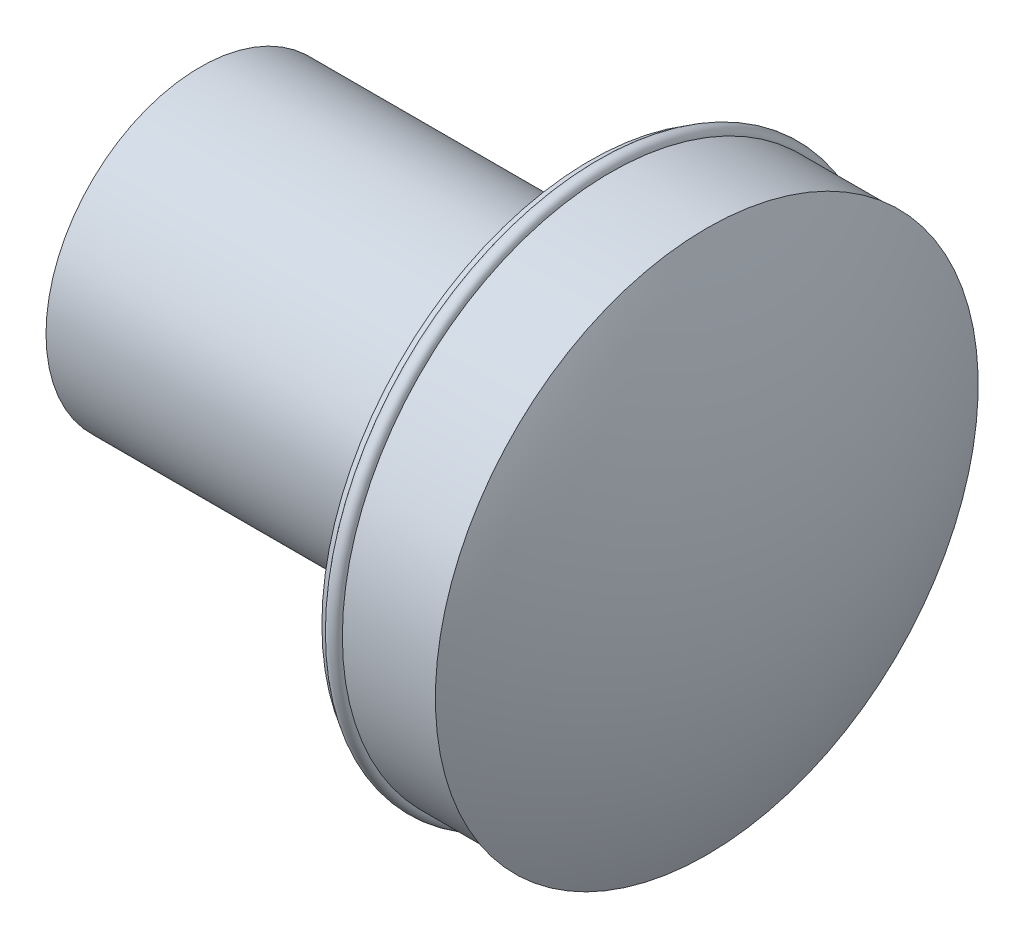
ISO-10303-21;
HEADER;
FILE_DESCRIPTION(('STEP AP214'),'2;1');
FILE_NAME('part.step','',(''),(''),'','','');
FILE_SCHEMA(('AUTOMOTIVE_DESIGN { 1 0 10303 214 1 1 1 1 }'));
ENDSEC;
DATA;
#1=APPLICATION_CONTEXT('core data for automotive mechanical design processes');
#2=APPLICATION_PROTOCOL_DEFINITION('international standard','automotive_design',2000,#1);
#3=PRODUCT_CONTEXT('',#1,'mechanical');
#4=PRODUCT('Part','Part','',(#3));
#5=PRODUCT_RELATED_PRODUCT_CATEGORY('part','',(#4));
#6=PRODUCT_DEFINITION_FORMATION('','',#4);
#7=PRODUCT_DEFINITION_CONTEXT('part definition',#1,'design');
#8=PRODUCT_DEFINITION('design','',#6,#7);
#9=PRODUCT_DEFINITION_SHAPE('','',#8);
#10=(LENGTH_UNIT() NAMED_UNIT(*) SI_UNIT(.MILLI.,.METRE.));
#11=(NAMED_UNIT(*) PLANE_ANGLE_UNIT() SI_UNIT($,.RADIAN.));
#12=(NAMED_UNIT(*) SI_UNIT($,.STERADIAN.) SOLID_ANGLE_UNIT());
#13=UNCERTAINTY_MEASURE_WITH_UNIT(LENGTH_MEASURE(1.E-05),#10,'distance_accuracy_value','');
#14=(GEOMETRIC_REPRESENTATION_CONTEXT(3) GLOBAL_UNCERTAINTY_ASSIGNED_CONTEXT((#13)) GLOBAL_UNIT_ASSIGNED_CONTEXT((#10,
#11,#12)) REPRESENTATION_CONTEXT('',''));
#15=CARTESIAN_POINT('',(0.,0.,0.));
#16=DIRECTION('',(0.,0.,1.));
#17=DIRECTION('',(1.,0.,0.));
#18=AXIS2_PLACEMENT_3D('',#15,#16,#17);
#19=CARTESIAN_POINT('',(0.,16.064574588347,0.));
#20=DIRECTION('',(1.,0.,0.));
#21=DIRECTION('',(0.,0.,-1.));
#22=AXIS2_PLACEMENT_3D('',#19,#20,#21);
#23=PLANE('',#22);
#24=CARTESIAN_POINT('',(0.,0.,0.));
#25=DIRECTION('',(-1.,0.,0.));
#26=DIRECTION('',(0.,0.,1.));
#27=AXIS2_PLACEMENT_3D('',#24,#25,#26);
#28=CIRCLE('',#27,16.064574588347);
#29=CARTESIAN_POINT('',(0.,0.,16.064574588347));
#30=VERTEX_POINT('',#29);
#31=EDGE_CURVE('E11',#30,#30,#28,.T.);
#32=ORIENTED_EDGE('',*,*,#31,.T.);
#33=EDGE_LOOP('',(#32));
#34=FACE_BOUND('',#33,.T.);
#35=ADVANCED_FACE('F37',(#34),#23,.F.);
#36=CARTESIAN_POINT('',(-76.840094259018,0.,0.));
#37=DIRECTION('',(-1.,0.,0.));
#38=DIRECTION('',(0.,0.,1.));
#39=AXIS2_PLACEMENT_3D('',#36,#37,#38);
#40=CYLINDRICAL_SURFACE('',#39,16.064574588347);
#41=ORIENTED_EDGE('',*,*,#31,.F.);
#42=EDGE_LOOP('',(#41));
#43=FACE_BOUND('',#42,.T.);
#44=CARTESIAN_POINT('',(33.02,0.,0.));
#45=DIRECTION('',(-1.,0.,0.));
#46=DIRECTION('',(0.,0.,1.));
#47=AXIS2_PLACEMENT_3D('',#44,#45,#46);
#48=CIRCLE('',#47,16.064574588347);
#49=CARTESIAN_POINT('',(33.02,0.,16.064574588347));
#50=VERTEX_POINT('',#49);
#51=EDGE_CURVE('E43',#50,#50,#48,.T.);
#52=ORIENTED_EDGE('',*,*,#51,.T.);
#53=EDGE_LOOP('',(#52));
#54=FACE_BOUND('',#53,.T.);
#55=ADVANCED_FACE('F67',(#43,#54),#40,.T.);
#56=CARTESIAN_POINT('',(40.64,0.,0.));
#57=DIRECTION('',(1.,0.,0.));
#58=DIRECTION('',(0.,0.,-1.));
#59=AXIS2_PLACEMENT_3D('',#56,#57,#58);
#60=CONICAL_SURFACE('',#59,27.94,1.00030551738156);
#61=ORIENTED_EDGE('',*,*,#51,.F.);
#62=EDGE_LOOP('',(#61));
#63=FACE_BOUND('',#62,.T.);
#64=CARTESIAN_POINT('',(40.64,0.,0.));
#65=DIRECTION('',(-1.,0.,0.));
#66=DIRECTION('',(0.,0.,1.));
#67=AXIS2_PLACEMENT_3D('',#64,#65,#66);
#68=CIRCLE('',#67,27.94);
#69=CARTESIAN_POINT('',(40.64,0.,27.94));
#70=VERTEX_POINT('',#69);
#71=EDGE_CURVE('E62',#70,#70,#68,.T.);
#72=ORIENTED_EDGE('',*,*,#71,.T.);
#73=EDGE_LOOP('',(#72));
#74=FACE_BOUND('',#73,.T.);
#75=ADVANCED_FACE('F69',(#63,#74),#60,.T.);
#76=CARTESIAN_POINT('',(-76.840094259018,0.,0.));
#77=DIRECTION('',(-1.,0.,0.));
#78=DIRECTION('',(0.,0.,1.));
#79=AXIS2_PLACEMENT_3D('',#76,#77,#78);
#80=CYLINDRICAL_SURFACE('',#79,27.94);
#81=ORIENTED_EDGE('',*,*,#71,.F.);
#82=EDGE_LOOP('',(#81));
#83=FACE_BOUND('',#82,.T.);
#84=CARTESIAN_POINT('',(41.3073633764196,0.,0.));
#85=DIRECTION('',(-1.,0.,0.));
#86=DIRECTION('',(0.,0.,1.));
#87=AXIS2_PLACEMENT_3D('',#84,#85,#86);
#88=CIRCLE('',#87,27.94);
#89=CARTESIAN_POINT('',(41.3073633764196,0.,27.94));
#90=VERTEX_POINT('',#89);
#91=EDGE_CURVE('E59',#90,#90,#88,.T.);
#92=ORIENTED_EDGE('',*,*,#91,.T.);
#93=EDGE_LOOP('',(#92));
#94=FACE_BOUND('',#93,.T.);
#95=ADVANCED_FACE('F72',(#83,#94),#80,.T.);
#96=CARTESIAN_POINT('',(42.0407830498265,0.,0.));
#97=DIRECTION('',(-1.,0.,0.));
#98=DIRECTION('',(0.,0.,1.));
#99=AXIS2_PLACEMENT_3D('',#96,#97,#98);
#100=TOROIDAL_SURFACE('',#99,27.94,0.733419673406878);
#101=ORIENTED_EDGE('',*,*,#91,.F.);
#102=EDGE_LOOP('',(#101));
#103=FACE_BOUND('',#102,.T.);
#104=CARTESIAN_POINT('',(42.7742027232334,0.,0.));
#105=DIRECTION('',(-1.,0.,0.));
#106=DIRECTION('',(0.,0.,1.));
#107=AXIS2_PLACEMENT_3D('',#104,#105,#106);
#108=CIRCLE('',#107,27.94);
#109=CARTESIAN_POINT('',(42.7742027232334,0.,27.94));
#110=VERTEX_POINT('',#109);
#111=EDGE_CURVE('E54',#110,#110,#108,.T.);
#112=ORIENTED_EDGE('',*,*,#111,.T.);
#113=EDGE_LOOP('',(#112));
#114=FACE_BOUND('',#113,.T.);
#115=ADVANCED_FACE('F78',(#103,#114),#100,.T.);
#116=CARTESIAN_POINT('',(-76.840094259018,0.,0.));
#117=DIRECTION('',(-1.,0.,0.));
#118=DIRECTION('',(0.,0.,1.));
#119=AXIS2_PLACEMENT_3D('',#116,#117,#118);
#120=CYLINDRICAL_SURFACE('',#119,27.94);
#121=ORIENTED_EDGE('',*,*,#111,.F.);
#122=EDGE_LOOP('',(#121));
#123=FACE_BOUND('',#122,.T.);
#124=CARTESIAN_POINT('',(52.832,0.,0.));
#125=DIRECTION('',(-1.,0.,0.));
#126=DIRECTION('',(0.,0.,1.));
#127=AXIS2_PLACEMENT_3D('',#124,#125,#126);
#128=CIRCLE('',#127,27.94);
#129=CARTESIAN_POINT('',(52.8319999999994,27.94,0.));
#130=VERTEX_POINT('',#129);
#131=EDGE_CURVE('E51',#130,#130,#128,.T.);
#132=ORIENTED_EDGE('',*,*,#131,.T.);
#133=EDGE_LOOP('',(#132));
#134=FACE_BOUND('',#133,.T.);
#135=ADVANCED_FACE('F84',(#123,#134),#120,.T.);
#136=CARTESIAN_POINT('',(-7.04513437276172,-0.35774030791276,0.));
#137=DIRECTION('',(-1.,0.,0.));
#138=DIRECTION('',(0.,1.,0.));
#139=AXIS2_PLACEMENT_3D('',#136,#137,#138);
#140=SPHERICAL_SURFACE('',#139,66.2271343727617);
#141=CARTESIAN_POINT('',(52.832,-0.35774030791275,0.));
#142=DIRECTION('',(-1.,0.,0.));
#143=DIRECTION('',(0.,0.,1.));
#144=AXIS2_PLACEMENT_3D('',#141,#142,#143);
#145=CIRCLE('',#144,28.2977403079128);
#146=EDGE_CURVE('E47',#130,#130,#145,.T.);
#147=ORIENTED_EDGE('',*,*,#146,.F.);
#148=EDGE_LOOP('',(#147));
#149=FACE_BOUND('',#148,.T.);
#150=ADVANCED_FACE('F48',(#149),#140,.T.);
#151=CARTESIAN_POINT('',(52.832,27.94,0.));
#152=DIRECTION('',(1.,0.,0.));
#153=DIRECTION('',(0.,0.,-1.));
#154=AXIS2_PLACEMENT_3D('',#151,#152,#153);
#155=PLANE('',#154);
#156=ORIENTED_EDGE('',*,*,#146,.T.);
#157=ORIENTED_EDGE('',*,*,#131,.F.);
#158=EDGE_LOOP('',(#156,#157));
#159=FACE_BOUND('',#158,.T.);
#160=ADVANCED_FACE('F91',(#159),#155,.F.);
#161=CLOSED_SHELL('',(#35,#55,#75,#95,#115,#135,#150,#160));
#162=MANIFOLD_SOLID_BREP('B2',#161);
#163=ADVANCED_BREP_SHAPE_REPRESENTATION('',(#18,#162),#14);
#164=SHAPE_DEFINITION_REPRESENTATION(#9,#163);
ENDSEC;
END-ISO-10303-21;
